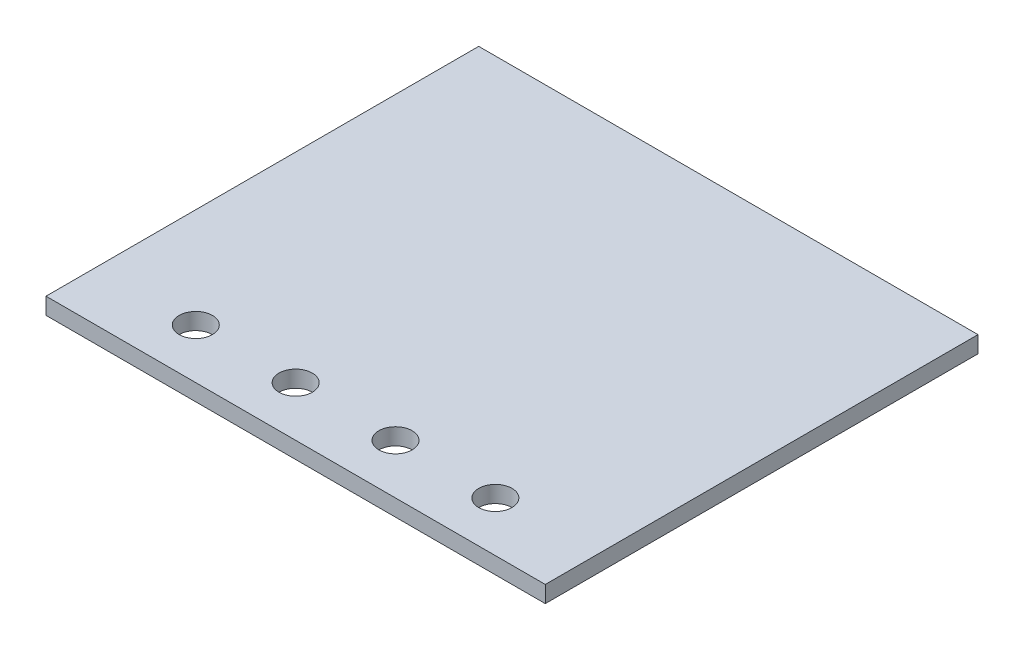
ISO-10303-21;
HEADER;
FILE_DESCRIPTION(('STEP AP214'),'2;1');
FILE_NAME('part.step','',(''),(''),'','','');
FILE_SCHEMA(('AUTOMOTIVE_DESIGN { 1 0 10303 214 1 1 1 1 }'));
ENDSEC;
DATA;
#1=APPLICATION_CONTEXT('core data for automotive mechanical design processes');
#2=APPLICATION_PROTOCOL_DEFINITION('international standard','automotive_design',2000,#1);
#3=PRODUCT_CONTEXT('',#1,'mechanical');
#4=PRODUCT('Part','Part','',(#3));
#5=PRODUCT_RELATED_PRODUCT_CATEGORY('part','',(#4));
#6=PRODUCT_DEFINITION_FORMATION('','',#4);
#7=PRODUCT_DEFINITION_CONTEXT('part definition',#1,'design');
#8=PRODUCT_DEFINITION('design','',#6,#7);
#9=PRODUCT_DEFINITION_SHAPE('','',#8);
#10=(LENGTH_UNIT() NAMED_UNIT(*) SI_UNIT(.MILLI.,.METRE.));
#11=(NAMED_UNIT(*) PLANE_ANGLE_UNIT() SI_UNIT($,.RADIAN.));
#12=(NAMED_UNIT(*) SI_UNIT($,.STERADIAN.) SOLID_ANGLE_UNIT());
#13=UNCERTAINTY_MEASURE_WITH_UNIT(LENGTH_MEASURE(1.E-05),#10,'distance_accuracy_value','');
#14=(GEOMETRIC_REPRESENTATION_CONTEXT(3) GLOBAL_UNCERTAINTY_ASSIGNED_CONTEXT((#13)) GLOBAL_UNIT_ASSIGNED_CONTEXT((#10,
#11,#12)) REPRESENTATION_CONTEXT('',''));
#15=CARTESIAN_POINT('',(0.,0.,0.));
#16=DIRECTION('',(0.,0.,1.));
#17=DIRECTION('',(1.,0.,0.));
#18=AXIS2_PLACEMENT_3D('',#15,#16,#17);
#19=CARTESIAN_POINT('',(150.,10.,130.));
#20=DIRECTION('',(-1.,0.,0.));
#21=DIRECTION('',(0.,0.,1.));
#22=AXIS2_PLACEMENT_3D('',#19,#20,#21);
#23=PLANE('',#22);
#24=DIRECTION('',(0.,0.,-1.));
#25=VECTOR('',#24,1.);
#26=CARTESIAN_POINT('',(150.,0.,130.));
#27=LINE('',#26,#25);
#28=CARTESIAN_POINT('',(150.,0.,130.));
#29=VERTEX_POINT('',#28);
#30=CARTESIAN_POINT('',(150.,0.,-130.));
#31=VERTEX_POINT('',#30);
#32=EDGE_CURVE('E102',#29,#31,#27,.T.);
#33=ORIENTED_EDGE('',*,*,#32,.T.);
#34=DIRECTION('',(0.,-1.,0.));
#35=VECTOR('',#34,1.);
#36=CARTESIAN_POINT('',(150.,10.,-130.));
#37=LINE('',#36,#35);
#38=CARTESIAN_POINT('',(150.,10.,-130.));
#39=VERTEX_POINT('',#38);
#40=EDGE_CURVE('E93',#39,#31,#37,.T.);
#41=ORIENTED_EDGE('',*,*,#40,.F.);
#42=DIRECTION('',(0.,0.,-1.));
#43=VECTOR('',#42,1.);
#44=CARTESIAN_POINT('',(150.,10.,130.));
#45=LINE('',#44,#43);
#46=CARTESIAN_POINT('',(150.,10.,130.));
#47=VERTEX_POINT('',#46);
#48=EDGE_CURVE('E87',#47,#39,#45,.T.);
#49=ORIENTED_EDGE('',*,*,#48,.F.);
#50=DIRECTION('',(0.,-1.,0.));
#51=VECTOR('',#50,1.);
#52=CARTESIAN_POINT('',(150.,10.,130.));
#53=LINE('',#52,#51);
#54=EDGE_CURVE('E98',#47,#29,#53,.T.);
#55=ORIENTED_EDGE('',*,*,#54,.T.);
#56=EDGE_LOOP('',(#33,#41,#49,#55));
#57=FACE_BOUND('',#56,.T.);
#58=ADVANCED_FACE('F33',(#57),#23,.F.);
#59=CARTESIAN_POINT('',(-150.,10.,-130.));
#60=DIRECTION('',(0.,0.,1.));
#61=DIRECTION('',(1.,0.,0.));
#62=AXIS2_PLACEMENT_3D('',#59,#60,#61);
#63=PLANE('',#62);
#64=DIRECTION('',(-1.,0.,0.));
#65=VECTOR('',#64,1.);
#66=CARTESIAN_POINT('',(-150.,0.,-130.));
#67=LINE('',#66,#65);
#68=CARTESIAN_POINT('',(-150.,0.,-130.));
#69=VERTEX_POINT('',#68);
#70=EDGE_CURVE('E92',#31,#69,#67,.T.);
#71=ORIENTED_EDGE('',*,*,#70,.T.);
#72=DIRECTION('',(0.,-1.,0.));
#73=VECTOR('',#72,1.);
#74=CARTESIAN_POINT('',(-150.,10.,-130.));
#75=LINE('',#74,#73);
#76=CARTESIAN_POINT('',(-150.,10.,-130.));
#77=VERTEX_POINT('',#76);
#78=EDGE_CURVE('E90',#77,#69,#75,.T.);
#79=ORIENTED_EDGE('',*,*,#78,.F.);
#80=DIRECTION('',(-1.,0.,0.));
#81=VECTOR('',#80,1.);
#82=CARTESIAN_POINT('',(-150.,10.,-130.));
#83=LINE('',#82,#81);
#84=EDGE_CURVE('E81',#39,#77,#83,.T.);
#85=ORIENTED_EDGE('',*,*,#84,.F.);
#86=ORIENTED_EDGE('',*,*,#40,.T.);
#87=EDGE_LOOP('',(#71,#79,#85,#86));
#88=FACE_BOUND('',#87,.T.);
#89=ADVANCED_FACE('F91',(#88),#63,.F.);
#90=CARTESIAN_POINT('',(-150.,10.,130.));
#91=DIRECTION('',(1.,0.,0.));
#92=DIRECTION('',(0.,0.,-1.));
#93=AXIS2_PLACEMENT_3D('',#90,#91,#92);
#94=PLANE('',#93);
#95=DIRECTION('',(0.,0.,1.));
#96=VECTOR('',#95,1.);
#97=CARTESIAN_POINT('',(-150.,0.,130.));
#98=LINE('',#97,#96);
#99=CARTESIAN_POINT('',(-150.,0.,130.));
#100=VERTEX_POINT('',#99);
#101=EDGE_CURVE('E67',#69,#100,#98,.T.);
#102=ORIENTED_EDGE('',*,*,#101,.T.);
#103=DIRECTION('',(0.,-1.,0.));
#104=VECTOR('',#103,1.);
#105=CARTESIAN_POINT('',(-150.,10.,130.));
#106=LINE('',#105,#104);
#107=CARTESIAN_POINT('',(-150.,10.,130.));
#108=VERTEX_POINT('',#107);
#109=EDGE_CURVE('E94',#108,#100,#106,.T.);
#110=ORIENTED_EDGE('',*,*,#109,.F.);
#111=DIRECTION('',(0.,0.,1.));
#112=VECTOR('',#111,1.);
#113=CARTESIAN_POINT('',(-150.,10.,130.));
#114=LINE('',#113,#112);
#115=EDGE_CURVE('E85',#77,#108,#114,.T.);
#116=ORIENTED_EDGE('',*,*,#115,.F.);
#117=ORIENTED_EDGE('',*,*,#78,.T.);
#118=EDGE_LOOP('',(#102,#110,#116,#117));
#119=FACE_BOUND('',#118,.T.);
#120=ADVANCED_FACE('F96',(#119),#94,.F.);
#121=CARTESIAN_POINT('',(-150.,10.,130.));
#122=DIRECTION('',(0.,0.,-1.));
#123=DIRECTION('',(-1.,0.,0.));
#124=AXIS2_PLACEMENT_3D('',#121,#122,#123);
#125=PLANE('',#124);
#126=DIRECTION('',(1.,0.,0.));
#127=VECTOR('',#126,1.);
#128=CARTESIAN_POINT('',(-150.,0.,130.));
#129=LINE('',#128,#127);
#130=EDGE_CURVE('E73',#100,#29,#129,.T.);
#131=ORIENTED_EDGE('',*,*,#130,.T.);
#132=ORIENTED_EDGE('',*,*,#54,.F.);
#133=DIRECTION('',(1.,0.,0.));
#134=VECTOR('',#133,1.);
#135=CARTESIAN_POINT('',(-150.,10.,130.));
#136=LINE('',#135,#134);
#137=EDGE_CURVE('E50',#108,#47,#136,.T.);
#138=ORIENTED_EDGE('',*,*,#137,.F.);
#139=ORIENTED_EDGE('',*,*,#109,.T.);
#140=EDGE_LOOP('',(#131,#132,#138,#139));
#141=FACE_BOUND('',#140,.T.);
#142=ADVANCED_FACE('F128',(#141),#125,.F.);
#143=CARTESIAN_POINT('',(0.,10.,0.));
#144=DIRECTION('',(0.,-1.,0.));
#145=DIRECTION('',(0.,0.,-1.));
#146=AXIS2_PLACEMENT_3D('',#143,#144,#145);
#147=PLANE('',#146);
#148=CARTESIAN_POINT('',(-30.,10.,100.));
#149=DIRECTION('',(0.,1.,0.));
#150=DIRECTION('',(0.,0.,1.));
#151=AXIS2_PLACEMENT_3D('',#148,#149,#150);
#152=CIRCLE('',#151,9.99999999999999);
#153=CARTESIAN_POINT('',(-30.,10.,110.));
#154=VERTEX_POINT('',#153);
#155=EDGE_CURVE('E171',#154,#154,#152,.T.);
#156=ORIENTED_EDGE('',*,*,#155,.F.);
#157=EDGE_LOOP('',(#156));
#158=FACE_BOUND('',#157,.T.);
#159=CARTESIAN_POINT('',(-90.,10.,100.));
#160=DIRECTION('',(0.,1.,0.));
#161=DIRECTION('',(0.,0.,1.));
#162=AXIS2_PLACEMENT_3D('',#159,#160,#161);
#163=CIRCLE('',#162,9.99999999999999);
#164=CARTESIAN_POINT('',(-90.,10.,110.));
#165=VERTEX_POINT('',#164);
#166=EDGE_CURVE('E172',#165,#165,#163,.T.);
#167=ORIENTED_EDGE('',*,*,#166,.F.);
#168=EDGE_LOOP('',(#167));
#169=FACE_BOUND('',#168,.T.);
#170=ORIENTED_EDGE('',*,*,#48,.T.);
#171=ORIENTED_EDGE('',*,*,#84,.T.);
#172=ORIENTED_EDGE('',*,*,#115,.T.);
#173=ORIENTED_EDGE('',*,*,#137,.T.);
#174=EDGE_LOOP('',(#170,#171,#172,#173));
#175=FACE_BOUND('',#174,.T.);
#176=CARTESIAN_POINT('',(30.,10.,100.));
#177=DIRECTION('',(0.,1.,0.));
#178=DIRECTION('',(0.,0.,1.));
#179=AXIS2_PLACEMENT_3D('',#176,#177,#178);
#180=CIRCLE('',#179,9.99999999999999);
#181=CARTESIAN_POINT('',(30.,10.,110.));
#182=VERTEX_POINT('',#181);
#183=EDGE_CURVE('E115',#182,#182,#180,.T.);
#184=ORIENTED_EDGE('',*,*,#183,.F.);
#185=EDGE_LOOP('',(#184));
#186=FACE_BOUND('',#185,.T.);
#187=CARTESIAN_POINT('',(90.,10.,100.));
#188=DIRECTION('',(0.,1.,0.));
#189=DIRECTION('',(0.,0.,1.));
#190=AXIS2_PLACEMENT_3D('',#187,#188,#189);
#191=CIRCLE('',#190,9.99999999999999);
#192=CARTESIAN_POINT('',(90.,10.,110.));
#193=VERTEX_POINT('',#192);
#194=EDGE_CURVE('E11',#193,#193,#191,.T.);
#195=ORIENTED_EDGE('',*,*,#194,.F.);
#196=EDGE_LOOP('',(#195));
#197=FACE_BOUND('',#196,.T.);
#198=ADVANCED_FACE('F82',(#158,#169,#175,#186,#197),#147,.F.);
#199=CARTESIAN_POINT('',(0.,0.,0.));
#200=DIRECTION('',(0.,-1.,0.));
#201=DIRECTION('',(0.,0.,-1.));
#202=AXIS2_PLACEMENT_3D('',#199,#200,#201);
#203=PLANE('',#202);
#204=CARTESIAN_POINT('',(-30.,0.,100.));
#205=DIRECTION('',(0.,1.,0.));
#206=DIRECTION('',(0.,0.,1.));
#207=AXIS2_PLACEMENT_3D('',#204,#205,#206);
#208=CIRCLE('',#207,9.99999999999999);
#209=CARTESIAN_POINT('',(-30.,0.,110.));
#210=VERTEX_POINT('',#209);
#211=EDGE_CURVE('E169',#210,#210,#208,.T.);
#212=ORIENTED_EDGE('',*,*,#211,.T.);
#213=EDGE_LOOP('',(#212));
#214=FACE_BOUND('',#213,.T.);
#215=CARTESIAN_POINT('',(-90.,0.,100.));
#216=DIRECTION('',(0.,1.,0.));
#217=DIRECTION('',(0.,0.,1.));
#218=AXIS2_PLACEMENT_3D('',#215,#216,#217);
#219=CIRCLE('',#218,9.99999999999999);
#220=CARTESIAN_POINT('',(-90.,0.,110.));
#221=VERTEX_POINT('',#220);
#222=EDGE_CURVE('E105',#221,#221,#219,.T.);
#223=ORIENTED_EDGE('',*,*,#222,.T.);
#224=EDGE_LOOP('',(#223));
#225=FACE_BOUND('',#224,.T.);
#226=ORIENTED_EDGE('',*,*,#32,.F.);
#227=ORIENTED_EDGE('',*,*,#130,.F.);
#228=ORIENTED_EDGE('',*,*,#101,.F.);
#229=ORIENTED_EDGE('',*,*,#70,.F.);
#230=EDGE_LOOP('',(#226,#227,#228,#229));
#231=FACE_BOUND('',#230,.T.);
#232=CARTESIAN_POINT('',(30.,0.,100.));
#233=DIRECTION('',(0.,1.,0.));
#234=DIRECTION('',(0.,0.,1.));
#235=AXIS2_PLACEMENT_3D('',#232,#233,#234);
#236=CIRCLE('',#235,9.99999999999999);
#237=CARTESIAN_POINT('',(30.,0.,110.));
#238=VERTEX_POINT('',#237);
#239=EDGE_CURVE('E112',#238,#238,#236,.T.);
#240=ORIENTED_EDGE('',*,*,#239,.T.);
#241=EDGE_LOOP('',(#240));
#242=FACE_BOUND('',#241,.T.);
#243=CARTESIAN_POINT('',(90.,0.,100.));
#244=DIRECTION('',(0.,1.,0.));
#245=DIRECTION('',(0.,0.,1.));
#246=AXIS2_PLACEMENT_3D('',#243,#244,#245);
#247=CIRCLE('',#246,9.99999999999999);
#248=CARTESIAN_POINT('',(90.,0.,110.));
#249=VERTEX_POINT('',#248);
#250=EDGE_CURVE('E42',#249,#249,#247,.T.);
#251=ORIENTED_EDGE('',*,*,#250,.T.);
#252=EDGE_LOOP('',(#251));
#253=FACE_BOUND('',#252,.T.);
#254=ADVANCED_FACE('F120',(#214,#225,#231,#242,#253),#203,.T.);
#255=CARTESIAN_POINT('',(-90.,0.,100.));
#256=DIRECTION('',(0.,1.,0.));
#257=DIRECTION('',(0.,0.,1.));
#258=AXIS2_PLACEMENT_3D('',#255,#256,#257);
#259=CYLINDRICAL_SURFACE('',#258,9.99999999999999);
#260=ORIENTED_EDGE('',*,*,#222,.F.);
#261=EDGE_LOOP('',(#260));
#262=FACE_BOUND('',#261,.T.);
#263=ORIENTED_EDGE('',*,*,#166,.T.);
#264=EDGE_LOOP('',(#263));
#265=FACE_BOUND('',#264,.T.);
#266=ADVANCED_FACE('F135',(#262,#265),#259,.F.);
#267=CARTESIAN_POINT('',(-30.,0.,100.));
#268=DIRECTION('',(0.,1.,0.));
#269=DIRECTION('',(0.,0.,1.));
#270=AXIS2_PLACEMENT_3D('',#267,#268,#269);
#271=CYLINDRICAL_SURFACE('',#270,9.99999999999999);
#272=ORIENTED_EDGE('',*,*,#211,.F.);
#273=EDGE_LOOP('',(#272));
#274=FACE_BOUND('',#273,.T.);
#275=ORIENTED_EDGE('',*,*,#155,.T.);
#276=EDGE_LOOP('',(#275));
#277=FACE_BOUND('',#276,.T.);
#278=ADVANCED_FACE('F151',(#274,#277),#271,.F.);
#279=CARTESIAN_POINT('',(30.,0.,100.));
#280=DIRECTION('',(0.,1.,0.));
#281=DIRECTION('',(0.,0.,1.));
#282=AXIS2_PLACEMENT_3D('',#279,#280,#281);
#283=CYLINDRICAL_SURFACE('',#282,9.99999999999999);
#284=ORIENTED_EDGE('',*,*,#239,.F.);
#285=EDGE_LOOP('',(#284));
#286=FACE_BOUND('',#285,.T.);
#287=ORIENTED_EDGE('',*,*,#183,.T.);
#288=EDGE_LOOP('',(#287));
#289=FACE_BOUND('',#288,.T.);
#290=ADVANCED_FACE('F124',(#286,#289),#283,.F.);
#291=CARTESIAN_POINT('',(90.,0.,100.));
#292=DIRECTION('',(0.,1.,0.));
#293=DIRECTION('',(0.,0.,1.));
#294=AXIS2_PLACEMENT_3D('',#291,#292,#293);
#295=CYLINDRICAL_SURFACE('',#294,9.99999999999999);
#296=ORIENTED_EDGE('',*,*,#250,.F.);
#297=EDGE_LOOP('',(#296));
#298=FACE_BOUND('',#297,.T.);
#299=ORIENTED_EDGE('',*,*,#194,.T.);
#300=EDGE_LOOP('',(#299));
#301=FACE_BOUND('',#300,.T.);
#302=ADVANCED_FACE('F35',(#298,#301),#295,.F.);
#303=CLOSED_SHELL('',(#58,#89,#120,#142,#198,#254,#266,#278,#290,#302));
#304=MANIFOLD_SOLID_BREP('B2',#303);
#305=ADVANCED_BREP_SHAPE_REPRESENTATION('',(#18,#304),#14);
#306=SHAPE_DEFINITION_REPRESENTATION(#9,#305);
ENDSEC;
END-ISO-10303-21;
